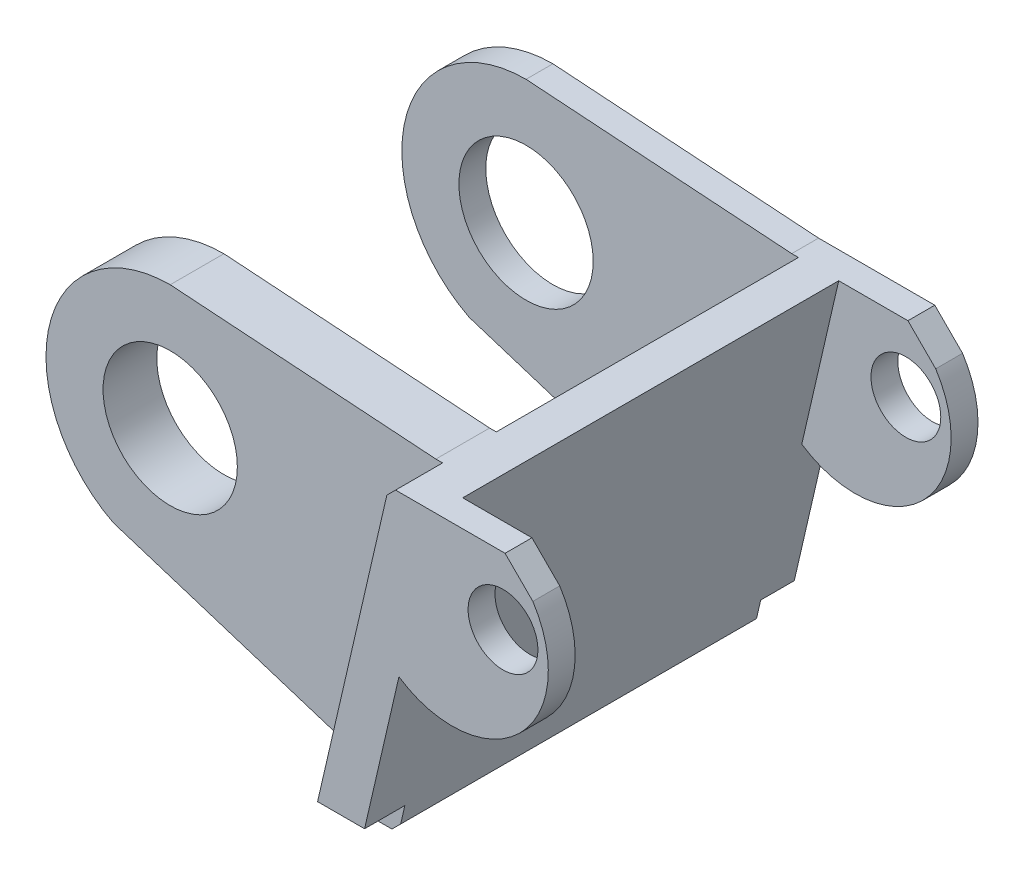
ISO-10303-21;
HEADER;
FILE_DESCRIPTION(('STEP AP214'),'2;1');
FILE_NAME('part.step','',(''),(''),'','','');
FILE_SCHEMA(('AUTOMOTIVE_DESIGN { 1 0 10303 214 1 1 1 1 }'));
ENDSEC;
DATA;
#1=APPLICATION_CONTEXT('core data for automotive mechanical design processes');
#2=APPLICATION_PROTOCOL_DEFINITION('international standard','automotive_design',2000,#1);
#3=PRODUCT_CONTEXT('',#1,'mechanical');
#4=PRODUCT('Part','Part','',(#3));
#5=PRODUCT_RELATED_PRODUCT_CATEGORY('part','',(#4));
#6=PRODUCT_DEFINITION_FORMATION('','',#4);
#7=PRODUCT_DEFINITION_CONTEXT('part definition',#1,'design');
#8=PRODUCT_DEFINITION('design','',#6,#7);
#9=PRODUCT_DEFINITION_SHAPE('','',#8);
#10=(LENGTH_UNIT() NAMED_UNIT(*) SI_UNIT(.MILLI.,.METRE.));
#11=(NAMED_UNIT(*) PLANE_ANGLE_UNIT() SI_UNIT($,.RADIAN.));
#12=(NAMED_UNIT(*) SI_UNIT($,.STERADIAN.) SOLID_ANGLE_UNIT());
#13=UNCERTAINTY_MEASURE_WITH_UNIT(LENGTH_MEASURE(1.E-05),#10,'distance_accuracy_value','');
#14=(GEOMETRIC_REPRESENTATION_CONTEXT(3) GLOBAL_UNCERTAINTY_ASSIGNED_CONTEXT((#13)) GLOBAL_UNIT_ASSIGNED_CONTEXT((#10,
#11,#12)) REPRESENTATION_CONTEXT('',''));
#15=CARTESIAN_POINT('',(0.,0.,0.));
#16=DIRECTION('',(0.,0.,1.));
#17=DIRECTION('',(1.,0.,0.));
#18=AXIS2_PLACEMENT_3D('',#15,#16,#17);
#19=CARTESIAN_POINT('',(10.1099099822132,160.217391304348,320.));
#20=DIRECTION('',(0.974370064785234,-0.224951054343869,0.));
#21=DIRECTION('',(0.224951054343869,0.974370064785234,0.));
#22=AXIS2_PLACEMENT_3D('',#19,#20,#21);
#23=PLANE('',#22);
#24=DIRECTION('',(-0.224951054343869,-0.974370064785234,0.));
#25=VECTOR('',#24,1.);
#26=CARTESIAN_POINT('',(-47.6071377991786,-89.7826086956521,25.));
#27=LINE('',#26,#25);
#28=CARTESIAN_POINT('',(-42.9897739766673,-69.7826086956521,25.));
#29=VERTEX_POINT('',#28);
#30=CARTESIAN_POINT('',(-46.4823825274592,-84.9107583717258,25.));
#31=VERTEX_POINT('',#30);
#32=EDGE_CURVE('E354',#29,#31,#27,.T.);
#33=ORIENTED_EDGE('',*,*,#32,.T.);
#34=DIRECTION('',(0.,0.,1.));
#35=VECTOR('',#34,1.);
#36=CARTESIAN_POINT('',(-46.4823825274592,-84.9107583717257,320.));
#37=LINE('',#36,#35);
#38=CARTESIAN_POINT('',(-46.4823825274592,-84.9107583717258,290.));
#39=VERTEX_POINT('',#38);
#40=EDGE_CURVE('E483',#31,#39,#37,.T.);
#41=ORIENTED_EDGE('',*,*,#40,.T.);
#42=DIRECTION('',(-0.224951054343869,-0.974370064785234,0.));
#43=VECTOR('',#42,1.);
#44=CARTESIAN_POINT('',(-47.6071377991786,-89.7826086956521,290.));
#45=LINE('',#44,#43);
#46=CARTESIAN_POINT('',(-42.9897739766673,-69.7826086956521,290.));
#47=VERTEX_POINT('',#46);
#48=EDGE_CURVE('E386',#47,#39,#45,.T.);
#49=ORIENTED_EDGE('',*,*,#48,.F.);
#50=DIRECTION('',(0.,0.,1.));
#51=VECTOR('',#50,1.);
#52=CARTESIAN_POINT('',(-42.9897739766673,-69.7826086956521,290.));
#53=LINE('',#52,#51);
#54=CARTESIAN_POINT('',(-42.9897739766673,-69.7826086956521,320.));
#55=VERTEX_POINT('',#54);
#56=EDGE_CURVE('E394',#47,#55,#53,.T.);
#57=ORIENTED_EDGE('',*,*,#56,.T.);
#58=DIRECTION('',(-0.224951054343869,-0.974370064785234,0.));
#59=VECTOR('',#58,1.);
#60=CARTESIAN_POINT('',(10.1099099822132,160.217391304348,320.));
#61=LINE('',#60,#59);
#62=CARTESIAN_POINT('',(8.60907365961052,153.716554981745,320.));
#63=VERTEX_POINT('',#62);
#64=EDGE_CURVE('E401',#63,#55,#61,.T.);
#65=ORIENTED_EDGE('',*,*,#64,.F.);
#66=DIRECTION('',(0.,0.,-1.));
#67=VECTOR('',#66,1.);
#68=CARTESIAN_POINT('',(8.60907365961052,153.716554981745,320.));
#69=LINE('',#68,#67);
#70=CARTESIAN_POINT('',(8.60907365961052,153.716554981745,285.));
#71=VERTEX_POINT('',#70);
#72=EDGE_CURVE('E427',#63,#71,#69,.T.);
#73=ORIENTED_EDGE('',*,*,#72,.T.);
#74=DIRECTION('',(-0.224951054343869,-0.974370064785234,0.));
#75=VECTOR('',#74,1.);
#76=CARTESIAN_POINT('',(-25.5190223393978,5.89153052678971,285.));
#77=LINE('',#76,#75);
#78=CARTESIAN_POINT('',(-40.98572608345,-61.1021235952716,285.));
#79=VERTEX_POINT('',#78);
#80=EDGE_CURVE('E279',#71,#79,#77,.T.);
#81=ORIENTED_EDGE('',*,*,#80,.T.);
#82=DIRECTION('',(0.,0.,1.));
#83=VECTOR('',#82,1.);
#84=CARTESIAN_POINT('',(-40.98572608345,-61.1021235952716,245.));
#85=LINE('',#84,#83);
#86=CARTESIAN_POINT('',(-40.98572608345,-61.1021235952716,245.));
#87=VERTEX_POINT('',#86);
#88=EDGE_CURVE('E312',#87,#79,#85,.T.);
#89=ORIENTED_EDGE('',*,*,#88,.F.);
#90=DIRECTION('',(-0.224951054343869,-0.974370064785234,0.));
#91=VECTOR('',#90,1.);
#92=CARTESIAN_POINT('',(-25.5190223393978,5.89153052678971,245.));
#93=LINE('',#92,#91);
#94=CARTESIAN_POINT('',(8.60907365961052,153.716554981745,245.));
#95=VERTEX_POINT('',#94);
#96=EDGE_CURVE('E290',#95,#87,#93,.T.);
#97=ORIENTED_EDGE('',*,*,#96,.F.);
#98=DIRECTION('',(0.,0.,-1.));
#99=VECTOR('',#98,1.);
#100=CARTESIAN_POINT('',(8.60907365961052,153.716554981745,320.));
#101=LINE('',#100,#99);
#102=CARTESIAN_POINT('',(8.60907365961052,153.716554981745,20.));
#103=VERTEX_POINT('',#102);
#104=EDGE_CURVE('E423',#95,#103,#101,.T.);
#105=ORIENTED_EDGE('',*,*,#104,.T.);
#106=DIRECTION('',(-0.224951054343869,-0.974370064785234,0.));
#107=VECTOR('',#106,1.);
#108=CARTESIAN_POINT('',(-25.5190223393978,5.89153052678971,20.));
#109=LINE('',#108,#107);
#110=CARTESIAN_POINT('',(-40.98572608345,-61.1021235952716,20.));
#111=VERTEX_POINT('',#110);
#112=EDGE_CURVE('E533',#103,#111,#109,.T.);
#113=ORIENTED_EDGE('',*,*,#112,.T.);
#114=DIRECTION('',(0.,0.,-1.));
#115=VECTOR('',#114,1.);
#116=CARTESIAN_POINT('',(-40.98572608345,-61.1021235952716,20.));
#117=LINE('',#116,#115);
#118=CARTESIAN_POINT('',(-40.98572608345,-61.1021235952716,0.));
#119=VERTEX_POINT('',#118);
#120=EDGE_CURVE('E270',#111,#119,#117,.T.);
#121=ORIENTED_EDGE('',*,*,#120,.T.);
#122=DIRECTION('',(-0.224951054343869,-0.974370064785234,0.));
#123=VECTOR('',#122,1.);
#124=CARTESIAN_POINT('',(10.1099099822132,160.217391304348,0.));
#125=LINE('',#124,#123);
#126=CARTESIAN_POINT('',(-42.9897739766673,-69.7826086956521,0.));
#127=VERTEX_POINT('',#126);
#128=EDGE_CURVE('E398',#119,#127,#125,.T.);
#129=ORIENTED_EDGE('',*,*,#128,.T.);
#130=DIRECTION('',(0.,0.,1.));
#131=VECTOR('',#130,1.);
#132=CARTESIAN_POINT('',(-42.9897739766673,-69.7826086956521,0.));
#133=LINE('',#132,#131);
#134=EDGE_CURVE('E367',#127,#29,#133,.T.);
#135=ORIENTED_EDGE('',*,*,#134,.T.);
#136=EDGE_LOOP('',(#33,#41,#49,#57,#65,#73,#81,#89,#97,#105,#113,#121,#129,#135));
#137=FACE_BOUND('',#136,.T.);
#138=ADVANCED_FACE('F53',(#137),#23,.F.);
#139=CARTESIAN_POINT('',(-47.6071377991786,-89.7826086956521,320.));
#140=DIRECTION('',(0.,1.,0.));
#141=DIRECTION('',(0.,0.,1.));
#142=AXIS2_PLACEMENT_3D('',#139,#140,#141);
#143=PLANE('',#142);
#144=DIRECTION('',(1.,0.,0.));
#145=VECTOR('',#144,1.);
#146=CARTESIAN_POINT('',(-12.6071377991786,-89.7826086956521,25.));
#147=LINE('',#146,#145);
#148=CARTESIAN_POINT('',(-43.4381125729482,-89.7826086956521,25.));
#149=VERTEX_POINT('',#148);
#150=CARTESIAN_POINT('',(-17.6071377991787,-89.7826086956521,25.));
#151=VERTEX_POINT('',#150);
#152=EDGE_CURVE('E348',#149,#151,#147,.T.);
#153=ORIENTED_EDGE('',*,*,#152,.T.);
#154=DIRECTION('',(0.,0.,1.));
#155=VECTOR('',#154,1.);
#156=CARTESIAN_POINT('',(-17.6071377991787,-89.7826086956521,320.));
#157=LINE('',#156,#155);
#158=CARTESIAN_POINT('',(-17.6071377991787,-89.7826086956521,290.));
#159=VERTEX_POINT('',#158);
#160=EDGE_CURVE('E474',#151,#159,#157,.T.);
#161=ORIENTED_EDGE('',*,*,#160,.T.);
#162=DIRECTION('',(1.,0.,0.));
#163=VECTOR('',#162,1.);
#164=CARTESIAN_POINT('',(-12.6071377991786,-89.7826086956521,290.));
#165=LINE('',#164,#163);
#166=CARTESIAN_POINT('',(-43.4381125729482,-89.7826086956521,290.));
#167=VERTEX_POINT('',#166);
#168=EDGE_CURVE('E375',#167,#159,#165,.T.);
#169=ORIENTED_EDGE('',*,*,#168,.F.);
#170=DIRECTION('',(0.,0.,-1.));
#171=VECTOR('',#170,1.);
#172=CARTESIAN_POINT('',(-43.4381125729482,-89.7826086956521,320.));
#173=LINE('',#172,#171);
#174=EDGE_CURVE('E470',#167,#149,#173,.T.);
#175=ORIENTED_EDGE('',*,*,#174,.T.);
#176=EDGE_LOOP('',(#153,#161,#169,#175));
#177=FACE_BOUND('',#176,.T.);
#178=ADVANCED_FACE('F569',(#177),#143,.F.);
#179=CARTESIAN_POINT('',(45.1099099822132,160.217391304348,320.));
#180=DIRECTION('',(-0.974370064785234,0.224951054343869,0.));
#181=DIRECTION('',(-0.224951054343869,-0.974370064785234,0.));
#182=AXIS2_PLACEMENT_3D('',#179,#180,#181);
#183=PLANE('',#182);
#184=DIRECTION('',(0.224951054343869,0.974370064785234,0.));
#185=VECTOR('',#184,1.);
#186=CARTESIAN_POINT('',(-7.98977397666728,-69.7826086956521,290.));
#187=LINE('',#186,#185);
#188=CARTESIAN_POINT('',(-11.106301476576,-83.2817723730494,290.));
#189=VERTEX_POINT('',#188);
#190=CARTESIAN_POINT('',(-7.98977397666728,-69.7826086956521,290.));
#191=VERTEX_POINT('',#190);
#192=EDGE_CURVE('E379',#189,#191,#187,.T.);
#193=ORIENTED_EDGE('',*,*,#192,.F.);
#194=DIRECTION('',(0.,0.,-1.));
#195=VECTOR('',#194,1.);
#196=CARTESIAN_POINT('',(-11.106301476576,-83.2817723730494,320.));
#197=LINE('',#196,#195);
#198=CARTESIAN_POINT('',(-11.106301476576,-83.2817723730494,25.));
#199=VERTEX_POINT('',#198);
#200=EDGE_CURVE('E460',#189,#199,#197,.T.);
#201=ORIENTED_EDGE('',*,*,#200,.T.);
#202=DIRECTION('',(0.224951054343869,0.974370064785234,0.));
#203=VECTOR('',#202,1.);
#204=CARTESIAN_POINT('',(-7.98977397666728,-69.7826086956521,25.));
#205=LINE('',#204,#203);
#206=CARTESIAN_POINT('',(-7.98977397666728,-69.7826086956521,25.));
#207=VERTEX_POINT('',#206);
#208=EDGE_CURVE('E358',#199,#207,#205,.T.);
#209=ORIENTED_EDGE('',*,*,#208,.T.);
#210=DIRECTION('',(0.,0.,1.));
#211=VECTOR('',#210,1.);
#212=CARTESIAN_POINT('',(-7.98977397666728,-69.7826086956521,0.));
#213=LINE('',#212,#211);
#214=CARTESIAN_POINT('',(-7.98977397666728,-69.7826086956521,0.));
#215=VERTEX_POINT('',#214);
#216=EDGE_CURVE('E353',#215,#207,#213,.T.);
#217=ORIENTED_EDGE('',*,*,#216,.F.);
#218=DIRECTION('',(0.224951054343869,0.974370064785234,0.));
#219=VECTOR('',#218,1.);
#220=CARTESIAN_POINT('',(45.1099099822132,160.217391304348,0.));
#221=LINE('',#220,#219);
#222=CARTESIAN_POINT('',(17.5919783415259,41.0241342925125,0.));
#223=VERTEX_POINT('',#222);
#224=EDGE_CURVE('E415',#215,#223,#221,.T.);
#225=ORIENTED_EDGE('',*,*,#224,.T.);
#226=DIRECTION('',(0.,0.,-1.));
#227=VECTOR('',#226,1.);
#228=CARTESIAN_POINT('',(17.5919783415259,41.0241342925125,20.));
#229=LINE('',#228,#227);
#230=CARTESIAN_POINT('',(17.5919783415259,41.0241342925125,20.));
#231=VERTEX_POINT('',#230);
#232=EDGE_CURVE('E525',#231,#223,#229,.T.);
#233=ORIENTED_EDGE('',*,*,#232,.F.);
#234=DIRECTION('',(-0.224951054343869,-0.974370064785234,0.));
#235=VECTOR('',#234,1.);
#236=CARTESIAN_POINT('',(45.1099099822132,160.217391304348,20.));
#237=LINE('',#236,#235);
#238=CARTESIAN_POINT('',(45.1099099822132,160.217391304348,20.));
#239=VERTEX_POINT('',#238);
#240=EDGE_CURVE('E623',#239,#231,#237,.T.);
#241=ORIENTED_EDGE('',*,*,#240,.F.);
#242=DIRECTION('',(0.,0.,-1.));
#243=VECTOR('',#242,1.);
#244=CARTESIAN_POINT('',(45.1099099822132,160.217391304348,320.));
#245=LINE('',#244,#243);
#246=CARTESIAN_POINT('',(45.1099099822132,160.217391304348,300.));
#247=VERTEX_POINT('',#246);
#248=EDGE_CURVE('E412',#247,#239,#245,.T.);
#249=ORIENTED_EDGE('',*,*,#248,.F.);
#250=DIRECTION('',(0.224951054343869,0.974370064785234,0.));
#251=VECTOR('',#250,1.);
#252=CARTESIAN_POINT('',(7.70987347083757,-1.77996454201927,300.));
#253=LINE('',#252,#251);
#254=CARTESIAN_POINT('',(17.5919783415259,41.0241342925125,300.));
#255=VERTEX_POINT('',#254);
#256=EDGE_CURVE('E325',#255,#247,#253,.T.);
#257=ORIENTED_EDGE('',*,*,#256,.F.);
#258=DIRECTION('',(0.,0.,1.));
#259=VECTOR('',#258,1.);
#260=CARTESIAN_POINT('',(17.5919783415259,41.0241342925125,300.));
#261=LINE('',#260,#259);
#262=CARTESIAN_POINT('',(17.5919783415259,41.0241342925125,320.));
#263=VERTEX_POINT('',#262);
#264=EDGE_CURVE('E338',#255,#263,#261,.T.);
#265=ORIENTED_EDGE('',*,*,#264,.T.);
#266=DIRECTION('',(0.224951054343869,0.974370064785234,0.));
#267=VECTOR('',#266,1.);
#268=CARTESIAN_POINT('',(45.1099099822132,160.217391304348,320.));
#269=LINE('',#268,#267);
#270=CARTESIAN_POINT('',(-7.98977397666729,-69.7826086956522,320.));
#271=VERTEX_POINT('',#270);
#272=EDGE_CURVE('E404',#271,#263,#269,.T.);
#273=ORIENTED_EDGE('',*,*,#272,.F.);
#274=DIRECTION('',(0.,0.,1.));
#275=VECTOR('',#274,1.);
#276=CARTESIAN_POINT('',(-7.98977397666728,-69.7826086956521,290.));
#277=LINE('',#276,#275);
#278=EDGE_CURVE('E390',#191,#271,#277,.T.);
#279=ORIENTED_EDGE('',*,*,#278,.F.);
#280=EDGE_LOOP('',(#193,#201,#209,#217,#225,#233,#241,#249,#257,#265,#273,#279));
#281=FACE_BOUND('',#280,.T.);
#282=ADVANCED_FACE('F550',(#281),#183,.F.);
#283=CARTESIAN_POINT('',(10.1099099822132,160.217391304348,320.));
#284=DIRECTION('',(0.,-1.,0.));
#285=DIRECTION('',(1.,0.,0.));
#286=AXIS2_PLACEMENT_3D('',#283,#284,#285);
#287=PLANE('',#286);
#288=DIRECTION('',(1.,0.,0.));
#289=VECTOR('',#288,1.);
#290=CARTESIAN_POINT('',(45.1099099822132,160.217391304348,20.));
#291=LINE('',#290,#289);
#292=CARTESIAN_POINT('',(96.6490742667404,160.217391304348,20.));
#293=VERTEX_POINT('',#292);
#294=EDGE_CURVE('E510',#239,#293,#291,.T.);
#295=ORIENTED_EDGE('',*,*,#294,.T.);
#296=DIRECTION('',(0.,0.,-1.));
#297=VECTOR('',#296,1.);
#298=CARTESIAN_POINT('',(96.6490742667404,160.217391304348,320.));
#299=LINE('',#298,#297);
#300=CARTESIAN_POINT('',(96.6490742667404,160.217391304348,0.));
#301=VERTEX_POINT('',#300);
#302=EDGE_CURVE('E499',#293,#301,#299,.T.);
#303=ORIENTED_EDGE('',*,*,#302,.T.);
#304=DIRECTION('',(-1.,0.,0.));
#305=VECTOR('',#304,1.);
#306=CARTESIAN_POINT('',(10.1099099822132,160.217391304348,0.));
#307=LINE('',#306,#305);
#308=CARTESIAN_POINT('',(10.1099099822132,160.217391304348,0.));
#309=VERTEX_POINT('',#308);
#310=EDGE_CURVE('E405',#301,#309,#307,.T.);
#311=ORIENTED_EDGE('',*,*,#310,.T.);
#312=DIRECTION('',(0.,0.,-1.));
#313=VECTOR('',#312,1.);
#314=CARTESIAN_POINT('',(10.1099099822132,160.217391304348,20.));
#315=LINE('',#314,#313);
#316=CARTESIAN_POINT('',(10.1099099822132,160.217391304348,20.));
#317=VERTEX_POINT('',#316);
#318=EDGE_CURVE('E531',#317,#309,#315,.T.);
#319=ORIENTED_EDGE('',*,*,#318,.F.);
#320=DIRECTION('',(1.,0.,0.));
#321=VECTOR('',#320,1.);
#322=CARTESIAN_POINT('',(-1.27055026265332E-13,160.217391304348,20.));
#323=LINE('',#322,#321);
#324=CARTESIAN_POINT('',(15.1099099822133,160.217391304348,20.));
#325=VERTEX_POINT('',#324);
#326=EDGE_CURVE('E252',#317,#325,#323,.T.);
#327=ORIENTED_EDGE('',*,*,#326,.T.);
#328=DIRECTION('',(0.,0.,1.));
#329=VECTOR('',#328,1.);
#330=CARTESIAN_POINT('',(15.1099099822133,160.217391304348,320.));
#331=LINE('',#330,#329);
#332=CARTESIAN_POINT('',(15.1099099822133,160.217391304348,245.));
#333=VERTEX_POINT('',#332);
#334=EDGE_CURVE('E434',#325,#333,#331,.T.);
#335=ORIENTED_EDGE('',*,*,#334,.T.);
#336=DIRECTION('',(-1.,0.,0.));
#337=VECTOR('',#336,1.);
#338=CARTESIAN_POINT('',(10.1099099822132,160.217391304348,245.));
#339=LINE('',#338,#337);
#340=CARTESIAN_POINT('',(10.1099099822132,160.217391304348,245.));
#341=VERTEX_POINT('',#340);
#342=EDGE_CURVE('E431',#333,#341,#339,.T.);
#343=ORIENTED_EDGE('',*,*,#342,.T.);
#344=DIRECTION('',(0.,0.,1.));
#345=VECTOR('',#344,1.);
#346=CARTESIAN_POINT('',(10.1099099822132,160.217391304348,245.));
#347=LINE('',#346,#345);
#348=CARTESIAN_POINT('',(10.1099099822132,160.217391304348,285.));
#349=VERTEX_POINT('',#348);
#350=EDGE_CURVE('E307',#341,#349,#347,.T.);
#351=ORIENTED_EDGE('',*,*,#350,.T.);
#352=DIRECTION('',(1.,0.,0.));
#353=VECTOR('',#352,1.);
#354=CARTESIAN_POINT('',(-1.27055026265332E-13,160.217391304348,285.));
#355=LINE('',#354,#353);
#356=CARTESIAN_POINT('',(15.1099099822133,160.217391304348,285.));
#357=VERTEX_POINT('',#356);
#358=EDGE_CURVE('E444',#349,#357,#355,.T.);
#359=ORIENTED_EDGE('',*,*,#358,.T.);
#360=DIRECTION('',(0.,0.,1.));
#361=VECTOR('',#360,1.);
#362=CARTESIAN_POINT('',(15.1099099822133,160.217391304348,320.));
#363=LINE('',#362,#361);
#364=CARTESIAN_POINT('',(15.1099099822133,160.217391304348,320.));
#365=VERTEX_POINT('',#364);
#366=EDGE_CURVE('E440',#357,#365,#363,.T.);
#367=ORIENTED_EDGE('',*,*,#366,.T.);
#368=DIRECTION('',(-1.,0.,0.));
#369=VECTOR('',#368,1.);
#370=CARTESIAN_POINT('',(10.1099099822132,160.217391304348,320.));
#371=LINE('',#370,#369);
#372=CARTESIAN_POINT('',(96.6490742667403,160.217391304348,320.));
#373=VERTEX_POINT('',#372);
#374=EDGE_CURVE('E409',#373,#365,#371,.T.);
#375=ORIENTED_EDGE('',*,*,#374,.F.);
#376=DIRECTION('',(0.,0.,-1.));
#377=VECTOR('',#376,1.);
#378=CARTESIAN_POINT('',(96.6490742667403,160.217391304348,300.));
#379=LINE('',#378,#377);
#380=CARTESIAN_POINT('',(96.6490742667403,160.217391304348,300.));
#381=VERTEX_POINT('',#380);
#382=EDGE_CURVE('E493',#373,#381,#379,.T.);
#383=ORIENTED_EDGE('',*,*,#382,.T.);
#384=DIRECTION('',(1.,0.,0.));
#385=VECTOR('',#384,1.);
#386=CARTESIAN_POINT('',(0.,160.217391304348,300.));
#387=LINE('',#386,#385);
#388=EDGE_CURVE('E334',#247,#381,#387,.T.);
#389=ORIENTED_EDGE('',*,*,#388,.F.);
#390=ORIENTED_EDGE('',*,*,#248,.T.);
#391=EDGE_LOOP('',(#295,#303,#311,#319,#327,#335,#343,#351,#359,#367,#375,#383,#389,#390));
#392=FACE_BOUND('',#391,.T.);
#393=ADVANCED_FACE('F508',(#392),#287,.F.);
#394=CARTESIAN_POINT('',(0.,0.,320.));
#395=DIRECTION('',(0.,0.,1.));
#396=DIRECTION('',(1.,0.,0.));
#397=AXIS2_PLACEMENT_3D('',#394,#395,#396);
#398=PLANE('',#397);
#399=CARTESIAN_POINT('',(57.2455263041332,100.62076279843,320.));
#400=DIRECTION('',(0.,0.,1.));
#401=DIRECTION('',(1.,0.,0.));
#402=AXIS2_PLACEMENT_3D('',#399,#400,#401);
#403=CIRCLE('',#402,71.583252198368);
#404=CARTESIAN_POINT('',(117.320219138465,139.546246432623,320.));
#405=VERTEX_POINT('',#404);
#406=EDGE_CURVE('E326',#263,#405,#403,.T.);
#407=ORIENTED_EDGE('',*,*,#406,.T.);
#408=DIRECTION('',(0.707106781186547,-0.707106781186548,0.));
#409=VECTOR('',#408,1.);
#410=CARTESIAN_POINT('',(128.433232785544,128.433232785544,320.));
#411=LINE('',#410,#409);
#412=EDGE_CURVE('E490',#405,#373,#411,.F.);
#413=ORIENTED_EDGE('',*,*,#412,.T.);
#414=ORIENTED_EDGE('',*,*,#374,.T.);
#415=DIRECTION('',(0.707106781186545,0.70710678118655,0.));
#416=VECTOR('',#415,1.);
#417=CARTESIAN_POINT('',(-72.5537406610673,72.5537406610666,320.));
#418=LINE('',#417,#416);
#419=EDGE_CURVE('E448',#365,#63,#418,.F.);
#420=ORIENTED_EDGE('',*,*,#419,.T.);
#421=ORIENTED_EDGE('',*,*,#64,.T.);
#422=DIRECTION('',(-1.,0.,0.));
#423=VECTOR('',#422,1.);
#424=CARTESIAN_POINT('',(-42.9897739766673,-69.7826086956521,320.));
#425=LINE('',#424,#423);
#426=EDGE_CURVE('E371',#271,#55,#425,.T.);
#427=ORIENTED_EDGE('',*,*,#426,.F.);
#428=ORIENTED_EDGE('',*,*,#272,.T.);
#429=EDGE_LOOP('',(#407,#413,#414,#420,#421,#427,#428));
#430=FACE_BOUND('',#429,.T.);
#431=CARTESIAN_POINT('',(95.1099099822132,110.217391304348,320.));
#432=DIRECTION('',(0.,0.,1.));
#433=DIRECTION('',(1.,0.,0.));
#434=AXIS2_PLACEMENT_3D('',#431,#432,#433);
#435=CIRCLE('',#434,26.);
#436=CARTESIAN_POINT('',(121.109909982213,110.217391304348,320.));
#437=VERTEX_POINT('',#436);
#438=EDGE_CURVE('E311',#437,#437,#435,.T.);
#439=ORIENTED_EDGE('',*,*,#438,.F.);
#440=EDGE_LOOP('',(#439));
#441=FACE_BOUND('',#440,.T.);
#442=ADVANCED_FACE('F580',(#430,#441),#398,.T.);
#443=CARTESIAN_POINT('',(0.,0.,0.));
#444=DIRECTION('',(0.,0.,1.));
#445=DIRECTION('',(1.,0.,0.));
#446=AXIS2_PLACEMENT_3D('',#443,#444,#445);
#447=PLANE('',#446);
#448=ORIENTED_EDGE('',*,*,#310,.F.);
#449=DIRECTION('',(-0.707106781186546,0.707106781186549,0.));
#450=VECTOR('',#449,1.);
#451=CARTESIAN_POINT('',(96.6490742667404,160.217391304348,0.));
#452=LINE('',#451,#450);
#453=CARTESIAN_POINT('',(117.320219138465,139.546246432623,0.));
#454=VERTEX_POINT('',#453);
#455=EDGE_CURVE('E77',#301,#454,#452,.F.);
#456=ORIENTED_EDGE('',*,*,#455,.T.);
#457=CARTESIAN_POINT('',(57.2455263041332,100.62076279843,0.));
#458=DIRECTION('',(0.,0.,1.));
#459=DIRECTION('',(1.,0.,0.));
#460=AXIS2_PLACEMENT_3D('',#457,#458,#459);
#461=CIRCLE('',#460,71.583252198368);
#462=EDGE_CURVE('E624',#223,#454,#461,.T.);
#463=ORIENTED_EDGE('',*,*,#462,.F.);
#464=ORIENTED_EDGE('',*,*,#224,.F.);
#465=DIRECTION('',(-1.,0.,0.));
#466=VECTOR('',#465,1.);
#467=CARTESIAN_POINT('',(-42.9897739766673,-69.7826086956521,0.));
#468=LINE('',#467,#466);
#469=EDGE_CURVE('E349',#215,#127,#468,.T.);
#470=ORIENTED_EDGE('',*,*,#469,.T.);
#471=ORIENTED_EDGE('',*,*,#128,.F.);
#472=DIRECTION('',(-0.953008870057957,0.302942393188632,0.));
#473=VECTOR('',#472,1.);
#474=CARTESIAN_POINT('',(-21.4020256939702,-67.3273889100817,0.));
#475=LINE('',#474,#473);
#476=CARTESIAN_POINT('',(-230.213971145214,-0.950262244380495,0.));
#477=VERTEX_POINT('',#476);
#478=EDGE_CURVE('E522',#119,#477,#475,.T.);
#479=ORIENTED_EDGE('',*,*,#478,.T.);
#480=CARTESIAN_POINT('',(-187.73189598055,81.2173913043479,0.));
#481=DIRECTION('',(0.,0.,1.));
#482=DIRECTION('',(1.,0.,0.));
#483=AXIS2_PLACEMENT_3D('',#480,#481,#482);
#484=CIRCLE('',#483,92.5);
#485=CARTESIAN_POINT('',(-187.73189598055,173.717391304348,0.));
#486=VERTEX_POINT('',#485);
#487=EDGE_CURVE('E516',#486,#477,#484,.T.);
#488=ORIENTED_EDGE('',*,*,#487,.F.);
#489=DIRECTION('',(-0.997679999854186,0.0680780279602103,0.));
#490=VECTOR('',#489,1.);
#491=CARTESIAN_POINT('',(10.9288347140342,160.161510880967,0.));
#492=LINE('',#491,#490);
#493=EDGE_CURVE('E261',#309,#486,#492,.T.);
#494=ORIENTED_EDGE('',*,*,#493,.F.);
#495=EDGE_LOOP('',(#448,#456,#463,#464,#470,#471,#479,#488,#494));
#496=FACE_BOUND('',#495,.T.);
#497=CARTESIAN_POINT('',(-187.73189598055,81.2173913043479,0.));
#498=DIRECTION('',(0.,0.,1.));
#499=DIRECTION('',(1.,0.,0.));
#500=AXIS2_PLACEMENT_3D('',#497,#498,#499);
#501=CIRCLE('',#500,50.);
#502=CARTESIAN_POINT('',(-137.73189598055,81.2173913043479,0.));
#503=VERTEX_POINT('',#502);
#504=EDGE_CURVE('E518',#503,#503,#501,.T.);
#505=ORIENTED_EDGE('',*,*,#504,.T.);
#506=EDGE_LOOP('',(#505));
#507=FACE_BOUND('',#506,.T.);
#508=CARTESIAN_POINT('',(95.1099099822132,110.217391304348,0.));
#509=DIRECTION('',(0.,0.,1.));
#510=DIRECTION('',(1.,0.,0.));
#511=AXIS2_PLACEMENT_3D('',#508,#509,#510);
#512=CIRCLE('',#511,26.);
#513=CARTESIAN_POINT('',(121.109909982213,110.217391304348,0.));
#514=VERTEX_POINT('',#513);
#515=EDGE_CURVE('E636',#514,#514,#512,.T.);
#516=ORIENTED_EDGE('',*,*,#515,.T.);
#517=EDGE_LOOP('',(#516));
#518=FACE_BOUND('',#517,.T.);
#519=ADVANCED_FACE('F513',(#496,#507,#518),#447,.F.);
#520=CARTESIAN_POINT('',(-42.9897739766673,-69.7826086956521,290.));
#521=DIRECTION('',(0.,1.,0.));
#522=DIRECTION('',(0.,0.,1.));
#523=AXIS2_PLACEMENT_3D('',#520,#521,#522);
#524=PLANE('',#523);
#525=ORIENTED_EDGE('',*,*,#426,.T.);
#526=ORIENTED_EDGE('',*,*,#56,.F.);
#527=DIRECTION('',(-1.,0.,0.));
#528=VECTOR('',#527,1.);
#529=CARTESIAN_POINT('',(-42.9897739766673,-69.7826086956521,290.));
#530=LINE('',#529,#528);
#531=EDGE_CURVE('E382',#191,#47,#530,.T.);
#532=ORIENTED_EDGE('',*,*,#531,.F.);
#533=ORIENTED_EDGE('',*,*,#278,.T.);
#534=EDGE_LOOP('',(#525,#526,#532,#533));
#535=FACE_BOUND('',#534,.T.);
#536=ADVANCED_FACE('F578',(#535),#524,.F.);
#537=CARTESIAN_POINT('',(0.,0.,290.));
#538=DIRECTION('',(0.,0.,-1.));
#539=DIRECTION('',(-1.,0.,0.));
#540=AXIS2_PLACEMENT_3D('',#537,#538,#539);
#541=PLANE('',#540);
#542=ORIENTED_EDGE('',*,*,#168,.T.);
#543=DIRECTION('',(-0.707106781186549,-0.707106781186546,0.));
#544=VECTOR('',#543,1.);
#545=CARTESIAN_POINT('',(-11.106301476576,-83.2817723730494,290.));
#546=LINE('',#545,#544);
#547=EDGE_CURVE('E480',#159,#189,#546,.F.);
#548=ORIENTED_EDGE('',*,*,#547,.T.);
#549=ORIENTED_EDGE('',*,*,#192,.T.);
#550=ORIENTED_EDGE('',*,*,#531,.T.);
#551=ORIENTED_EDGE('',*,*,#48,.T.);
#552=DIRECTION('',(-0.529919264233193,0.848048096156433,0.));
#553=VECTOR('',#552,1.);
#554=CARTESIAN_POINT('',(-43.4381125729482,-89.7826086956521,290.));
#555=LINE('',#554,#553);
#556=EDGE_CURVE('E477',#39,#167,#555,.F.);
#557=ORIENTED_EDGE('',*,*,#556,.T.);
#558=EDGE_LOOP('',(#542,#548,#549,#550,#551,#557));
#559=FACE_BOUND('',#558,.T.);
#560=ADVANCED_FACE('F566',(#559),#541,.F.);
#561=CARTESIAN_POINT('',(-42.9897739766673,-69.7826086956521,0.));
#562=DIRECTION('',(0.,1.,0.));
#563=DIRECTION('',(0.,0.,1.));
#564=AXIS2_PLACEMENT_3D('',#561,#562,#563);
#565=PLANE('',#564);
#566=DIRECTION('',(-1.,0.,0.));
#567=VECTOR('',#566,1.);
#568=CARTESIAN_POINT('',(-42.9897739766673,-69.7826086956521,25.));
#569=LINE('',#568,#567);
#570=EDGE_CURVE('E361',#207,#29,#569,.T.);
#571=ORIENTED_EDGE('',*,*,#570,.T.);
#572=ORIENTED_EDGE('',*,*,#134,.F.);
#573=ORIENTED_EDGE('',*,*,#469,.F.);
#574=ORIENTED_EDGE('',*,*,#216,.T.);
#575=EDGE_LOOP('',(#571,#572,#573,#574));
#576=FACE_BOUND('',#575,.T.);
#577=ADVANCED_FACE('F546',(#576),#565,.F.);
#578=CARTESIAN_POINT('',(0.,0.,24.9999999999999));
#579=DIRECTION('',(0.,0.,-1.));
#580=DIRECTION('',(-1.,0.,0.));
#581=AXIS2_PLACEMENT_3D('',#578,#579,#580);
#582=PLANE('',#581);
#583=ORIENTED_EDGE('',*,*,#208,.F.);
#584=DIRECTION('',(0.707106781186549,0.707106781186546,0.));
#585=VECTOR('',#584,1.);
#586=CARTESIAN_POINT('',(36.0877354482368,-36.0877354482369,24.9999999999999));
#587=LINE('',#586,#585);
#588=EDGE_CURVE('E467',#199,#151,#587,.F.);
#589=ORIENTED_EDGE('',*,*,#588,.T.);
#590=ORIENTED_EDGE('',*,*,#152,.F.);
#591=DIRECTION('',(0.529919264233193,-0.848048096156433,0.));
#592=VECTOR('',#591,1.);
#593=CARTESIAN_POINT('',(-71.5881009763823,-44.7332102615301,24.9999999999999));
#594=LINE('',#593,#592);
#595=EDGE_CURVE('E464',#149,#31,#594,.F.);
#596=ORIENTED_EDGE('',*,*,#595,.T.);
#597=ORIENTED_EDGE('',*,*,#32,.F.);
#598=ORIENTED_EDGE('',*,*,#570,.F.);
#599=EDGE_LOOP('',(#583,#589,#590,#596,#597,#598));
#600=FACE_BOUND('',#599,.T.);
#601=ADVANCED_FACE('F555',(#600),#582,.T.);
#602=CARTESIAN_POINT('',(95.1099099822132,110.217391304348,300.));
#603=DIRECTION('',(0.,0.,1.));
#604=DIRECTION('',(1.,0.,0.));
#605=AXIS2_PLACEMENT_3D('',#602,#603,#604);
#606=CYLINDRICAL_SURFACE('',#605,26.);
#607=CARTESIAN_POINT('',(95.1099099822132,110.217391304348,300.));
#608=DIRECTION('',(0.,0.,1.));
#609=DIRECTION('',(1.,0.,0.));
#610=AXIS2_PLACEMENT_3D('',#607,#608,#609);
#611=CIRCLE('',#610,26.);
#612=CARTESIAN_POINT('',(121.109909982213,110.217391304348,300.));
#613=VERTEX_POINT('',#612);
#614=EDGE_CURVE('E321',#613,#613,#611,.T.);
#615=ORIENTED_EDGE('',*,*,#614,.F.);
#616=EDGE_LOOP('',(#615));
#617=FACE_BOUND('',#616,.T.);
#618=ORIENTED_EDGE('',*,*,#438,.T.);
#619=EDGE_LOOP('',(#618));
#620=FACE_BOUND('',#619,.T.);
#621=ADVANCED_FACE('F708',(#617,#620),#606,.F.);
#622=CARTESIAN_POINT('',(57.2455263041332,100.62076279843,300.));
#623=DIRECTION('',(0.,0.,1.));
#624=DIRECTION('',(1.,0.,0.));
#625=AXIS2_PLACEMENT_3D('',#622,#623,#624);
#626=CYLINDRICAL_SURFACE('',#625,71.583252198368);
#627=CARTESIAN_POINT('',(57.2455263041332,100.62076279843,300.));
#628=DIRECTION('',(0.,0.,1.));
#629=DIRECTION('',(1.,0.,0.));
#630=AXIS2_PLACEMENT_3D('',#627,#628,#629);
#631=CIRCLE('',#630,71.583252198368);
#632=CARTESIAN_POINT('',(117.320219138465,139.546246432623,300.));
#633=VERTEX_POINT('',#632);
#634=EDGE_CURVE('E330',#255,#633,#631,.T.);
#635=ORIENTED_EDGE('',*,*,#634,.T.);
#636=DIRECTION('',(0.,0.,1.));
#637=VECTOR('',#636,1.);
#638=CARTESIAN_POINT('',(117.320219138465,139.546246432623,300.));
#639=LINE('',#638,#637);
#640=EDGE_CURVE('E486',#633,#405,#639,.T.);
#641=ORIENTED_EDGE('',*,*,#640,.T.);
#642=ORIENTED_EDGE('',*,*,#406,.F.);
#643=ORIENTED_EDGE('',*,*,#264,.F.);
#644=EDGE_LOOP('',(#635,#641,#642,#643));
#645=FACE_BOUND('',#644,.T.);
#646=ADVANCED_FACE('F705',(#645),#626,.T.);
#647=CARTESIAN_POINT('',(0.,0.,300.));
#648=DIRECTION('',(0.,0.,1.));
#649=DIRECTION('',(1.,0.,0.));
#650=AXIS2_PLACEMENT_3D('',#647,#648,#649);
#651=PLANE('',#650);
#652=ORIENTED_EDGE('',*,*,#614,.T.);
#653=EDGE_LOOP('',(#652));
#654=FACE_BOUND('',#653,.T.);
#655=ORIENTED_EDGE('',*,*,#388,.T.);
#656=DIRECTION('',(-0.707106781186547,0.707106781186548,0.));
#657=VECTOR('',#656,1.);
#658=CARTESIAN_POINT('',(117.320219138465,139.546246432623,300.));
#659=LINE('',#658,#657);
#660=EDGE_CURVE('E496',#381,#633,#659,.F.);
#661=ORIENTED_EDGE('',*,*,#660,.T.);
#662=ORIENTED_EDGE('',*,*,#634,.F.);
#663=ORIENTED_EDGE('',*,*,#256,.T.);
#664=EDGE_LOOP('',(#655,#661,#662,#663));
#665=FACE_BOUND('',#664,.T.);
#666=ADVANCED_FACE('F702',(#654,#665),#651,.F.);
#667=CARTESIAN_POINT('',(10.9288347140342,160.161510880967,245.));
#668=DIRECTION('',(0.0680780279602103,0.997679999854186,0.));
#669=DIRECTION('',(-0.997679999854186,0.0680780279602103,0.));
#670=AXIS2_PLACEMENT_3D('',#667,#668,#669);
#671=PLANE('',#670);
#672=DIRECTION('',(-0.997679999854186,0.0680780279602103,0.));
#673=VECTOR('',#672,1.);
#674=CARTESIAN_POINT('',(10.9288347140342,160.161510880967,285.));
#675=LINE('',#674,#673);
#676=CARTESIAN_POINT('',(-187.73189598055,173.717391304348,285.));
#677=VERTEX_POINT('',#676);
#678=EDGE_CURVE('E268',#349,#677,#675,.T.);
#679=ORIENTED_EDGE('',*,*,#678,.F.);
#680=ORIENTED_EDGE('',*,*,#350,.F.);
#681=DIRECTION('',(-0.997679999854186,0.0680780279602103,0.));
#682=VECTOR('',#681,1.);
#683=CARTESIAN_POINT('',(10.9288347140342,160.161510880967,245.));
#684=LINE('',#683,#682);
#685=CARTESIAN_POINT('',(-187.73189598055,173.717391304348,245.));
#686=VERTEX_POINT('',#685);
#687=EDGE_CURVE('E278',#341,#686,#684,.T.);
#688=ORIENTED_EDGE('',*,*,#687,.T.);
#689=DIRECTION('',(0.,0.,1.));
#690=VECTOR('',#689,1.);
#691=CARTESIAN_POINT('',(-187.73189598055,173.717391304348,245.));
#692=LINE('',#691,#690);
#693=EDGE_CURVE('E292',#686,#677,#692,.T.);
#694=ORIENTED_EDGE('',*,*,#693,.T.);
#695=EDGE_LOOP('',(#679,#680,#688,#694));
#696=FACE_BOUND('',#695,.T.);
#697=ADVANCED_FACE('F597',(#696),#671,.T.);
#698=CARTESIAN_POINT('',(-21.4020256939702,-67.3273889100817,245.));
#699=DIRECTION('',(0.302942393188632,0.953008870057957,0.));
#700=DIRECTION('',(-0.953008870057957,0.302942393188632,0.));
#701=AXIS2_PLACEMENT_3D('',#698,#699,#700);
#702=PLANE('',#701);
#703=DIRECTION('',(-0.953008870057957,0.302942393188632,0.));
#704=VECTOR('',#703,1.);
#705=CARTESIAN_POINT('',(-21.4020256939702,-67.3273889100817,285.));
#706=LINE('',#705,#704);
#707=CARTESIAN_POINT('',(-230.213971145214,-0.950262244380495,285.));
#708=VERTEX_POINT('',#707);
#709=EDGE_CURVE('E301',#79,#708,#706,.T.);
#710=ORIENTED_EDGE('',*,*,#709,.T.);
#711=DIRECTION('',(0.,0.,1.));
#712=VECTOR('',#711,1.);
#713=CARTESIAN_POINT('',(-230.213971145214,-0.950262244380495,245.));
#714=LINE('',#713,#712);
#715=CARTESIAN_POINT('',(-230.213971145214,-0.950262244380495,245.));
#716=VERTEX_POINT('',#715);
#717=EDGE_CURVE('E316',#716,#708,#714,.T.);
#718=ORIENTED_EDGE('',*,*,#717,.F.);
#719=DIRECTION('',(-0.953008870057957,0.302942393188632,0.));
#720=VECTOR('',#719,1.);
#721=CARTESIAN_POINT('',(-21.4020256939702,-67.3273889100817,245.));
#722=LINE('',#721,#720);
#723=EDGE_CURVE('E287',#87,#716,#722,.T.);
#724=ORIENTED_EDGE('',*,*,#723,.F.);
#725=ORIENTED_EDGE('',*,*,#88,.T.);
#726=EDGE_LOOP('',(#710,#718,#724,#725));
#727=FACE_BOUND('',#726,.T.);
#728=ADVANCED_FACE('F605',(#727),#702,.F.);
#729=CARTESIAN_POINT('',(-187.73189598055,81.2173913043479,245.));
#730=DIRECTION('',(0.,0.,1.));
#731=DIRECTION('',(1.,0.,0.));
#732=AXIS2_PLACEMENT_3D('',#729,#730,#731);
#733=CYLINDRICAL_SURFACE('',#732,50.);
#734=CARTESIAN_POINT('',(-187.73189598055,81.2173913043479,245.));
#735=DIRECTION('',(0.,0.,1.));
#736=DIRECTION('',(1.,0.,0.));
#737=AXIS2_PLACEMENT_3D('',#734,#735,#736);
#738=CIRCLE('',#737,50.);
#739=CARTESIAN_POINT('',(-137.73189598055,81.2173913043479,245.));
#740=VERTEX_POINT('',#739);
#741=EDGE_CURVE('E274',#740,#740,#738,.T.);
#742=ORIENTED_EDGE('',*,*,#741,.F.);
#743=EDGE_LOOP('',(#742));
#744=FACE_BOUND('',#743,.T.);
#745=CARTESIAN_POINT('',(-187.73189598055,81.2173913043479,285.));
#746=DIRECTION('',(0.,0.,1.));
#747=DIRECTION('',(1.,0.,0.));
#748=AXIS2_PLACEMENT_3D('',#745,#746,#747);
#749=CIRCLE('',#748,50.);
#750=CARTESIAN_POINT('',(-137.73189598055,81.2173913043479,285.));
#751=VERTEX_POINT('',#750);
#752=EDGE_CURVE('E263',#751,#751,#749,.T.);
#753=ORIENTED_EDGE('',*,*,#752,.T.);
#754=EDGE_LOOP('',(#753));
#755=FACE_BOUND('',#754,.T.);
#756=ADVANCED_FACE('F791',(#744,#755),#733,.F.);
#757=CARTESIAN_POINT('',(-187.73189598055,81.2173913043479,245.));
#758=DIRECTION('',(0.,0.,1.));
#759=DIRECTION('',(1.,0.,0.));
#760=AXIS2_PLACEMENT_3D('',#757,#758,#759);
#761=CYLINDRICAL_SURFACE('',#760,92.5);
#762=CARTESIAN_POINT('',(-187.73189598055,81.2173913043479,285.));
#763=DIRECTION('',(0.,0.,1.));
#764=DIRECTION('',(1.,0.,0.));
#765=AXIS2_PLACEMENT_3D('',#762,#763,#764);
#766=CIRCLE('',#765,92.5);
#767=EDGE_CURVE('E297',#677,#708,#766,.T.);
#768=ORIENTED_EDGE('',*,*,#767,.F.);
#769=ORIENTED_EDGE('',*,*,#693,.F.);
#770=CARTESIAN_POINT('',(-187.73189598055,81.2173913043479,245.));
#771=DIRECTION('',(0.,0.,1.));
#772=DIRECTION('',(1.,0.,0.));
#773=AXIS2_PLACEMENT_3D('',#770,#771,#772);
#774=CIRCLE('',#773,92.5);
#775=EDGE_CURVE('E283',#686,#716,#774,.T.);
#776=ORIENTED_EDGE('',*,*,#775,.T.);
#777=ORIENTED_EDGE('',*,*,#717,.T.);
#778=EDGE_LOOP('',(#768,#769,#776,#777));
#779=FACE_BOUND('',#778,.T.);
#780=ADVANCED_FACE('F600',(#779),#761,.T.);
#781=CARTESIAN_POINT('',(0.,0.,245.));
#782=DIRECTION('',(0.,0.,1.));
#783=DIRECTION('',(1.,0.,0.));
#784=AXIS2_PLACEMENT_3D('',#781,#782,#783);
#785=PLANE('',#784);
#786=ORIENTED_EDGE('',*,*,#741,.T.);
#787=EDGE_LOOP('',(#786));
#788=FACE_BOUND('',#787,.T.);
#789=ORIENTED_EDGE('',*,*,#687,.F.);
#790=ORIENTED_EDGE('',*,*,#342,.F.);
#791=DIRECTION('',(0.707106781186545,0.70710678118655,0.));
#792=VECTOR('',#791,1.);
#793=CARTESIAN_POINT('',(-72.5537406610673,72.5537406610666,245.));
#794=LINE('',#793,#792);
#795=EDGE_CURVE('E457',#333,#95,#794,.F.);
#796=ORIENTED_EDGE('',*,*,#795,.T.);
#797=ORIENTED_EDGE('',*,*,#96,.T.);
#798=ORIENTED_EDGE('',*,*,#723,.T.);
#799=ORIENTED_EDGE('',*,*,#775,.F.);
#800=EDGE_LOOP('',(#789,#790,#796,#797,#798,#799));
#801=FACE_BOUND('',#800,.T.);
#802=ADVANCED_FACE('F808',(#788,#801),#785,.F.);
#803=CARTESIAN_POINT('',(0.,0.,285.));
#804=DIRECTION('',(0.,0.,1.));
#805=DIRECTION('',(1.,0.,0.));
#806=AXIS2_PLACEMENT_3D('',#803,#804,#805);
#807=PLANE('',#806);
#808=ORIENTED_EDGE('',*,*,#752,.F.);
#809=EDGE_LOOP('',(#808));
#810=FACE_BOUND('',#809,.T.);
#811=ORIENTED_EDGE('',*,*,#678,.T.);
#812=ORIENTED_EDGE('',*,*,#767,.T.);
#813=ORIENTED_EDGE('',*,*,#709,.F.);
#814=ORIENTED_EDGE('',*,*,#80,.F.);
#815=DIRECTION('',(-0.707106781186545,-0.70710678118655,0.));
#816=VECTOR('',#815,1.);
#817=CARTESIAN_POINT('',(8.60907365961052,153.716554981745,285.));
#818=LINE('',#817,#816);
#819=EDGE_CURVE('E451',#71,#357,#818,.F.);
#820=ORIENTED_EDGE('',*,*,#819,.T.);
#821=ORIENTED_EDGE('',*,*,#358,.F.);
#822=EDGE_LOOP('',(#811,#812,#813,#814,#820,#821));
#823=FACE_BOUND('',#822,.T.);
#824=ADVANCED_FACE('F590',(#810,#823),#807,.T.);
#825=CARTESIAN_POINT('',(10.9288347140342,160.161510880967,20.));
#826=DIRECTION('',(-0.0680780279602103,-0.997679999854186,0.));
#827=DIRECTION('',(0.997679999854186,-0.0680780279602103,0.));
#828=AXIS2_PLACEMENT_3D('',#825,#826,#827);
#829=PLANE('',#828);
#830=ORIENTED_EDGE('',*,*,#493,.T.);
#831=DIRECTION('',(0.,0.,-1.));
#832=VECTOR('',#831,1.);
#833=CARTESIAN_POINT('',(-187.73189598055,173.717391304348,20.));
#834=LINE('',#833,#832);
#835=CARTESIAN_POINT('',(-187.73189598055,173.717391304348,20.));
#836=VERTEX_POINT('',#835);
#837=EDGE_CURVE('E239',#836,#486,#834,.T.);
#838=ORIENTED_EDGE('',*,*,#837,.F.);
#839=DIRECTION('',(-0.997679999854186,0.0680780279602103,0.));
#840=VECTOR('',#839,1.);
#841=CARTESIAN_POINT('',(10.9288347140342,160.161510880967,20.));
#842=LINE('',#841,#840);
#843=EDGE_CURVE('E247',#317,#836,#842,.T.);
#844=ORIENTED_EDGE('',*,*,#843,.F.);
#845=ORIENTED_EDGE('',*,*,#318,.T.);
#846=EDGE_LOOP('',(#830,#838,#844,#845));
#847=FACE_BOUND('',#846,.T.);
#848=ADVANCED_FACE('F259',(#847),#829,.F.);
#849=CARTESIAN_POINT('',(-187.73189598055,81.2173913043479,20.));
#850=DIRECTION('',(0.,0.,-1.));
#851=DIRECTION('',(-1.,0.,0.));
#852=AXIS2_PLACEMENT_3D('',#849,#850,#851);
#853=CYLINDRICAL_SURFACE('',#852,92.5);
#854=ORIENTED_EDGE('',*,*,#487,.T.);
#855=DIRECTION('',(0.,0.,-1.));
#856=VECTOR('',#855,1.);
#857=CARTESIAN_POINT('',(-230.213971145214,-0.950262244380495,20.));
#858=LINE('',#857,#856);
#859=CARTESIAN_POINT('',(-230.213971145214,-0.950262244380495,20.));
#860=VERTEX_POINT('',#859);
#861=EDGE_CURVE('E241',#860,#477,#858,.T.);
#862=ORIENTED_EDGE('',*,*,#861,.F.);
#863=CARTESIAN_POINT('',(-187.73189598055,81.2173913043479,20.));
#864=DIRECTION('',(0.,0.,1.));
#865=DIRECTION('',(1.,0.,0.));
#866=AXIS2_PLACEMENT_3D('',#863,#864,#865);
#867=CIRCLE('',#866,92.5);
#868=EDGE_CURVE('E234',#836,#860,#867,.T.);
#869=ORIENTED_EDGE('',*,*,#868,.F.);
#870=ORIENTED_EDGE('',*,*,#837,.T.);
#871=EDGE_LOOP('',(#854,#862,#869,#870));
#872=FACE_BOUND('',#871,.T.);
#873=ADVANCED_FACE('F237',(#872),#853,.T.);
#874=CARTESIAN_POINT('',(-21.4020256939702,-67.3273889100817,20.));
#875=DIRECTION('',(-0.302942393188632,-0.953008870057957,0.));
#876=DIRECTION('',(0.953008870057957,-0.302942393188632,0.));
#877=AXIS2_PLACEMENT_3D('',#874,#875,#876);
#878=PLANE('',#877);
#879=ORIENTED_EDGE('',*,*,#478,.F.);
#880=ORIENTED_EDGE('',*,*,#120,.F.);
#881=DIRECTION('',(-0.953008870057957,0.302942393188632,0.));
#882=VECTOR('',#881,1.);
#883=CARTESIAN_POINT('',(-21.4020256939702,-67.3273889100817,20.));
#884=LINE('',#883,#882);
#885=EDGE_CURVE('E246',#111,#860,#884,.T.);
#886=ORIENTED_EDGE('',*,*,#885,.T.);
#887=ORIENTED_EDGE('',*,*,#861,.T.);
#888=EDGE_LOOP('',(#879,#880,#886,#887));
#889=FACE_BOUND('',#888,.T.);
#890=ADVANCED_FACE('F542',(#889),#878,.T.);
#891=CARTESIAN_POINT('',(-187.73189598055,81.2173913043479,20.));
#892=DIRECTION('',(0.,0.,-1.));
#893=DIRECTION('',(-1.,0.,0.));
#894=AXIS2_PLACEMENT_3D('',#891,#892,#893);
#895=CYLINDRICAL_SURFACE('',#894,50.);
#896=CARTESIAN_POINT('',(-187.73189598055,81.2173913043479,20.));
#897=DIRECTION('',(0.,0.,1.));
#898=DIRECTION('',(1.,0.,0.));
#899=AXIS2_PLACEMENT_3D('',#896,#897,#898);
#900=CIRCLE('',#899,50.);
#901=CARTESIAN_POINT('',(-137.73189598055,81.2173913043479,20.));
#902=VERTEX_POINT('',#901);
#903=EDGE_CURVE('E257',#902,#902,#900,.T.);
#904=ORIENTED_EDGE('',*,*,#903,.T.);
#905=EDGE_LOOP('',(#904));
#906=FACE_BOUND('',#905,.T.);
#907=ORIENTED_EDGE('',*,*,#504,.F.);
#908=EDGE_LOOP('',(#907));
#909=FACE_BOUND('',#908,.T.);
#910=ADVANCED_FACE('F657',(#906,#909),#895,.F.);
#911=CARTESIAN_POINT('',(0.,0.,20.));
#912=DIRECTION('',(0.,0.,1.));
#913=DIRECTION('',(1.,0.,0.));
#914=AXIS2_PLACEMENT_3D('',#911,#912,#913);
#915=PLANE('',#914);
#916=ORIENTED_EDGE('',*,*,#903,.F.);
#917=EDGE_LOOP('',(#916));
#918=FACE_BOUND('',#917,.T.);
#919=ORIENTED_EDGE('',*,*,#843,.T.);
#920=ORIENTED_EDGE('',*,*,#868,.T.);
#921=ORIENTED_EDGE('',*,*,#885,.F.);
#922=ORIENTED_EDGE('',*,*,#112,.F.);
#923=DIRECTION('',(-0.707106781186545,-0.70710678118655,0.));
#924=VECTOR('',#923,1.);
#925=CARTESIAN_POINT('',(8.60907365961052,153.716554981745,20.));
#926=LINE('',#925,#924);
#927=EDGE_CURVE('E454',#103,#325,#926,.F.);
#928=ORIENTED_EDGE('',*,*,#927,.T.);
#929=ORIENTED_EDGE('',*,*,#326,.F.);
#930=EDGE_LOOP('',(#919,#920,#921,#922,#928,#929));
#931=FACE_BOUND('',#930,.T.);
#932=ADVANCED_FACE('F250',(#918,#931),#915,.T.);
#933=CARTESIAN_POINT('',(57.2455263041332,100.62076279843,20.));
#934=DIRECTION('',(0.,0.,1.));
#935=DIRECTION('',(1.,0.,0.));
#936=AXIS2_PLACEMENT_3D('',#933,#934,#935);
#937=PLANE('',#936);
#938=CARTESIAN_POINT('',(57.2455263041332,100.62076279843,20.));
#939=DIRECTION('',(0.,0.,1.));
#940=DIRECTION('',(1.,0.,0.));
#941=AXIS2_PLACEMENT_3D('',#938,#939,#940);
#942=CIRCLE('',#941,71.583252198368);
#943=CARTESIAN_POINT('',(117.320219138465,139.546246432623,20.));
#944=VERTEX_POINT('',#943);
#945=EDGE_CURVE('E631',#231,#944,#942,.T.);
#946=ORIENTED_EDGE('',*,*,#945,.T.);
#947=DIRECTION('',(0.707106781186546,-0.707106781186549,0.));
#948=VECTOR('',#947,1.);
#949=CARTESIAN_POINT('',(106.745614538396,150.120851032693,20.));
#950=LINE('',#949,#948);
#951=EDGE_CURVE('E12',#944,#293,#950,.F.);
#952=ORIENTED_EDGE('',*,*,#951,.T.);
#953=ORIENTED_EDGE('',*,*,#294,.F.);
#954=ORIENTED_EDGE('',*,*,#240,.T.);
#955=EDGE_LOOP('',(#946,#952,#953,#954));
#956=FACE_BOUND('',#955,.T.);
#957=CARTESIAN_POINT('',(95.1099099822132,110.217391304348,20.));
#958=DIRECTION('',(0.,0.,1.));
#959=DIRECTION('',(1.,0.,0.));
#960=AXIS2_PLACEMENT_3D('',#957,#958,#959);
#961=CIRCLE('',#960,26.);
#962=CARTESIAN_POINT('',(121.109909982213,110.217391304348,20.));
#963=VERTEX_POINT('',#962);
#964=EDGE_CURVE('E627',#963,#963,#961,.T.);
#965=ORIENTED_EDGE('',*,*,#964,.F.);
#966=EDGE_LOOP('',(#965));
#967=FACE_BOUND('',#966,.T.);
#968=ADVANCED_FACE('F647',(#956,#967),#937,.T.);
#969=CARTESIAN_POINT('',(57.2455263041332,100.62076279843,20.));
#970=DIRECTION('',(0.,0.,-1.));
#971=DIRECTION('',(-1.,0.,0.));
#972=AXIS2_PLACEMENT_3D('',#969,#970,#971);
#973=CYLINDRICAL_SURFACE('',#972,71.583252198368);
#974=ORIENTED_EDGE('',*,*,#462,.T.);
#975=DIRECTION('',(0.,0.,-1.));
#976=VECTOR('',#975,1.);
#977=CARTESIAN_POINT('',(117.320219138465,139.546246432623,20.));
#978=LINE('',#977,#976);
#979=EDGE_CURVE('E63',#454,#944,#978,.F.);
#980=ORIENTED_EDGE('',*,*,#979,.T.);
#981=ORIENTED_EDGE('',*,*,#945,.F.);
#982=ORIENTED_EDGE('',*,*,#232,.T.);
#983=EDGE_LOOP('',(#974,#980,#981,#982));
#984=FACE_BOUND('',#983,.T.);
#985=ADVANCED_FACE('F649',(#984),#973,.T.);
#986=CARTESIAN_POINT('',(95.1099099822132,110.217391304348,20.));
#987=DIRECTION('',(0.,0.,-1.));
#988=DIRECTION('',(-1.,0.,0.));
#989=AXIS2_PLACEMENT_3D('',#986,#987,#988);
#990=CYLINDRICAL_SURFACE('',#989,26.);
#991=ORIENTED_EDGE('',*,*,#964,.T.);
#992=EDGE_LOOP('',(#991));
#993=FACE_BOUND('',#992,.T.);
#994=ORIENTED_EDGE('',*,*,#515,.F.);
#995=EDGE_LOOP('',(#994));
#996=FACE_BOUND('',#995,.T.);
#997=ADVANCED_FACE('F644',(#993,#996),#990,.F.);
#998=CARTESIAN_POINT('',(8.60907365961052,153.716554981745,320.));
#999=DIRECTION('',(0.70710678118655,-0.707106781186545,0.));
#1000=DIRECTION('',(0.,0.,-1.));
#1001=AXIS2_PLACEMENT_3D('',#998,#999,#1000);
#1002=PLANE('',#1001);
#1003=ORIENTED_EDGE('',*,*,#419,.F.);
#1004=ORIENTED_EDGE('',*,*,#366,.F.);
#1005=ORIENTED_EDGE('',*,*,#819,.F.);
#1006=ORIENTED_EDGE('',*,*,#72,.F.);
#1007=EDGE_LOOP('',(#1003,#1004,#1005,#1006));
#1008=FACE_BOUND('',#1007,.T.);
#1009=ADVANCED_FACE('F587',(#1008),#1002,.F.);
#1010=CARTESIAN_POINT('',(8.60907365961052,153.716554981745,320.));
#1011=DIRECTION('',(0.70710678118655,-0.707106781186545,0.));
#1012=DIRECTION('',(0.,0.,-1.));
#1013=AXIS2_PLACEMENT_3D('',#1010,#1011,#1012);
#1014=PLANE('',#1013);
#1015=ORIENTED_EDGE('',*,*,#795,.F.);
#1016=ORIENTED_EDGE('',*,*,#334,.F.);
#1017=ORIENTED_EDGE('',*,*,#927,.F.);
#1018=ORIENTED_EDGE('',*,*,#104,.F.);
#1019=EDGE_LOOP('',(#1015,#1016,#1017,#1018));
#1020=FACE_BOUND('',#1019,.T.);
#1021=ADVANCED_FACE('F612',(#1020),#1014,.F.);
#1022=CARTESIAN_POINT('',(-11.106301476576,-83.2817723730494,320.));
#1023=DIRECTION('',(-0.707106781186546,0.707106781186549,0.));
#1024=DIRECTION('',(0.,0.,-1.));
#1025=AXIS2_PLACEMENT_3D('',#1022,#1023,#1024);
#1026=PLANE('',#1025);
#1027=ORIENTED_EDGE('',*,*,#547,.F.);
#1028=ORIENTED_EDGE('',*,*,#160,.F.);
#1029=ORIENTED_EDGE('',*,*,#588,.F.);
#1030=ORIENTED_EDGE('',*,*,#200,.F.);
#1031=EDGE_LOOP('',(#1027,#1028,#1029,#1030));
#1032=FACE_BOUND('',#1031,.T.);
#1033=ADVANCED_FACE('F572',(#1032),#1026,.F.);
#1034=CARTESIAN_POINT('',(-43.4381125729482,-89.7826086956521,320.));
#1035=DIRECTION('',(0.848048096156433,0.529919264233193,0.));
#1036=DIRECTION('',(0.,0.,-1.));
#1037=AXIS2_PLACEMENT_3D('',#1034,#1035,#1036);
#1038=PLANE('',#1037);
#1039=ORIENTED_EDGE('',*,*,#556,.F.);
#1040=ORIENTED_EDGE('',*,*,#40,.F.);
#1041=ORIENTED_EDGE('',*,*,#595,.F.);
#1042=ORIENTED_EDGE('',*,*,#174,.F.);
#1043=EDGE_LOOP('',(#1039,#1040,#1041,#1042));
#1044=FACE_BOUND('',#1043,.T.);
#1045=ADVANCED_FACE('F562',(#1044),#1038,.F.);
#1046=CARTESIAN_POINT('',(117.320219138465,139.546246432623,300.));
#1047=DIRECTION('',(-0.707106781186548,-0.707106781186547,0.));
#1048=DIRECTION('',(0.,0.,1.));
#1049=AXIS2_PLACEMENT_3D('',#1046,#1047,#1048);
#1050=PLANE('',#1049);
#1051=ORIENTED_EDGE('',*,*,#660,.F.);
#1052=ORIENTED_EDGE('',*,*,#382,.F.);
#1053=ORIENTED_EDGE('',*,*,#412,.F.);
#1054=ORIENTED_EDGE('',*,*,#640,.F.);
#1055=EDGE_LOOP('',(#1051,#1052,#1053,#1054));
#1056=FACE_BOUND('',#1055,.T.);
#1057=ADVANCED_FACE('F689',(#1056),#1050,.F.);
#1058=CARTESIAN_POINT('',(96.6490742667404,160.217391304348,20.));
#1059=DIRECTION('',(-0.707106781186549,-0.707106781186546,0.));
#1060=DIRECTION('',(0.,0.,-1.));
#1061=AXIS2_PLACEMENT_3D('',#1058,#1059,#1060);
#1062=PLANE('',#1061);
#1063=ORIENTED_EDGE('',*,*,#951,.F.);
#1064=ORIENTED_EDGE('',*,*,#979,.F.);
#1065=ORIENTED_EDGE('',*,*,#455,.F.);
#1066=ORIENTED_EDGE('',*,*,#302,.F.);
#1067=EDGE_LOOP('',(#1063,#1064,#1065,#1066));
#1068=FACE_BOUND('',#1067,.T.);
#1069=ADVANCED_FACE('F56',(#1068),#1062,.F.);
#1070=CLOSED_SHELL('',(#138,#178,#282,#393,#442,#519,#536,#560,#577,#601,#621,#646,#666,#697,
#728,#756,#780,#802,#824,#848,#873,#890,#910,#932,#968,#985,#997,#1009,#1021,#1033,#1045,#1057,#1069));
#1071=MANIFOLD_SOLID_BREP('B2',#1070);
#1072=ADVANCED_BREP_SHAPE_REPRESENTATION('',(#18,#1071),#14);
#1073=SHAPE_DEFINITION_REPRESENTATION(#9,#1072);
ENDSEC;
END-ISO-10303-21;
